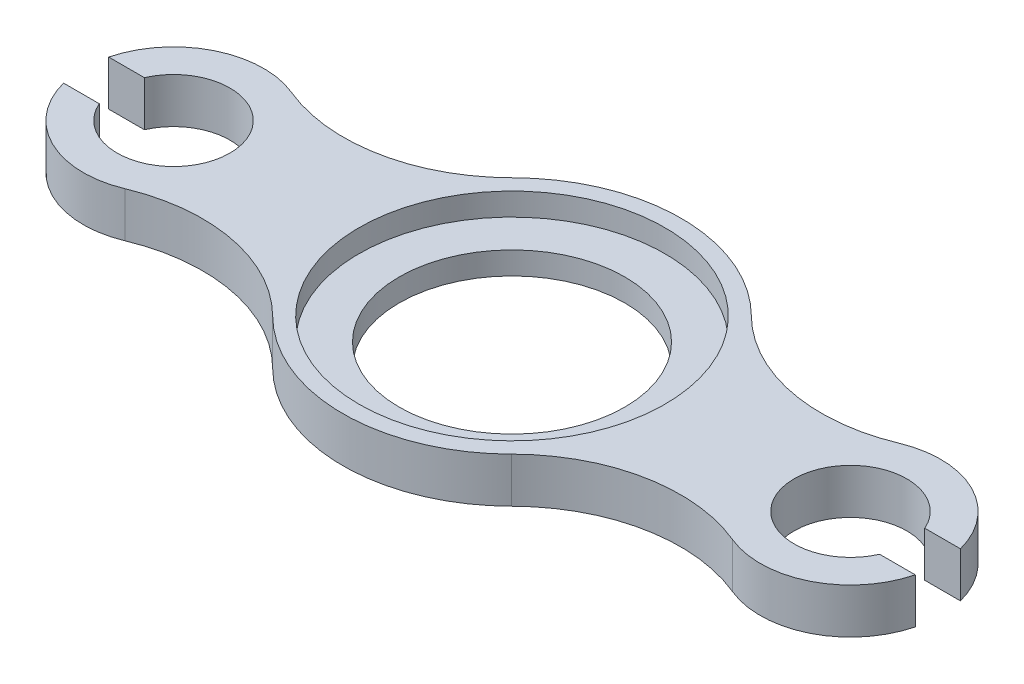
ISO-10303-21;
HEADER;
FILE_DESCRIPTION(('STEP AP214'),'2;1');
FILE_NAME('part.step','',(''),(''),'','','');
FILE_SCHEMA(('AUTOMOTIVE_DESIGN { 1 0 10303 214 1 1 1 1 }'));
ENDSEC;
DATA;
#1=APPLICATION_CONTEXT('core data for automotive mechanical design processes');
#2=APPLICATION_PROTOCOL_DEFINITION('international standard','automotive_design',2000,#1);
#3=PRODUCT_CONTEXT('',#1,'mechanical');
#4=PRODUCT('Part','Part','',(#3));
#5=PRODUCT_RELATED_PRODUCT_CATEGORY('part','',(#4));
#6=PRODUCT_DEFINITION_FORMATION('','',#4);
#7=PRODUCT_DEFINITION_CONTEXT('part definition',#1,'design');
#8=PRODUCT_DEFINITION('design','',#6,#7);
#9=PRODUCT_DEFINITION_SHAPE('','',#8);
#10=(LENGTH_UNIT() NAMED_UNIT(*) SI_UNIT(.MILLI.,.METRE.));
#11=(NAMED_UNIT(*) PLANE_ANGLE_UNIT() SI_UNIT($,.RADIAN.));
#12=(NAMED_UNIT(*) SI_UNIT($,.STERADIAN.) SOLID_ANGLE_UNIT());
#13=UNCERTAINTY_MEASURE_WITH_UNIT(LENGTH_MEASURE(1.E-05),#10,'distance_accuracy_value','');
#14=(GEOMETRIC_REPRESENTATION_CONTEXT(3) GLOBAL_UNCERTAINTY_ASSIGNED_CONTEXT((#13)) GLOBAL_UNIT_ASSIGNED_CONTEXT((#10,
#11,#12)) REPRESENTATION_CONTEXT('',''));
#15=CARTESIAN_POINT('',(0.,0.,0.));
#16=DIRECTION('',(0.,0.,1.));
#17=DIRECTION('',(1.,0.,0.));
#18=AXIS2_PLACEMENT_3D('',#15,#16,#17);
#19=CARTESIAN_POINT('',(-150.,20.,0.));
#20=DIRECTION('',(0.,-1.,0.));
#21=DIRECTION('',(0.,0.,-1.));
#22=AXIS2_PLACEMENT_3D('',#19,#20,#21);
#23=CYLINDRICAL_SURFACE('',#22,25.);
#24=CARTESIAN_POINT('',(-150.,0.,0.));
#25=DIRECTION('',(0.,1.,0.));
#26=DIRECTION('',(0.,0.,1.));
#27=AXIS2_PLACEMENT_3D('',#24,#25,#26);
#28=CIRCLE('',#27,25.);
#29=CARTESIAN_POINT('',(-172.912878474779,0.,-10.));
#30=VERTEX_POINT('',#29);
#31=CARTESIAN_POINT('',(-172.912878474779,0.,10.));
#32=VERTEX_POINT('',#31);
#33=EDGE_CURVE('E183',#30,#32,#28,.F.);
#34=ORIENTED_EDGE('',*,*,#33,.T.);
#35=DIRECTION('',(0.,-1.,0.));
#36=VECTOR('',#35,1.);
#37=CARTESIAN_POINT('',(-172.912878474779,20.,10.));
#38=LINE('',#37,#36);
#39=CARTESIAN_POINT('',(-172.912878474779,20.,10.));
#40=VERTEX_POINT('',#39);
#41=EDGE_CURVE('E11',#40,#32,#38,.T.);
#42=ORIENTED_EDGE('',*,*,#41,.F.);
#43=CARTESIAN_POINT('',(-150.,20.,0.));
#44=DIRECTION('',(0.,1.,0.));
#45=DIRECTION('',(0.,0.,1.));
#46=AXIS2_PLACEMENT_3D('',#43,#44,#45);
#47=CIRCLE('',#46,25.);
#48=CARTESIAN_POINT('',(-172.912878474779,20.,-10.));
#49=VERTEX_POINT('',#48);
#50=EDGE_CURVE('E505',#49,#40,#47,.F.);
#51=ORIENTED_EDGE('',*,*,#50,.F.);
#52=DIRECTION('',(0.,-1.,0.));
#53=VECTOR('',#52,1.);
#54=CARTESIAN_POINT('',(-172.912878474779,20.,-10.));
#55=LINE('',#54,#53);
#56=EDGE_CURVE('E54',#49,#30,#55,.T.);
#57=ORIENTED_EDGE('',*,*,#56,.T.);
#58=EDGE_LOOP('',(#34,#42,#51,#57));
#59=FACE_BOUND('',#58,.T.);
#60=ADVANCED_FACE('F37',(#59),#23,.F.);
#61=CARTESIAN_POINT('',(0.,20.,10.));
#62=DIRECTION('',(0.,0.,1.));
#63=DIRECTION('',(1.,0.,0.));
#64=AXIS2_PLACEMENT_3D('',#61,#62,#63);
#65=PLANE('',#64);
#66=DIRECTION('',(-1.,0.,0.));
#67=VECTOR('',#66,1.);
#68=CARTESIAN_POINT('',(0.,0.,10.));
#69=LINE('',#68,#67);
#70=CARTESIAN_POINT('',(-188.729833462074,0.,9.99999999999999));
#71=VERTEX_POINT('',#70);
#72=EDGE_CURVE('E185',#32,#71,#69,.T.);
#73=ORIENTED_EDGE('',*,*,#72,.T.);
#74=DIRECTION('',(0.,-1.,0.));
#75=VECTOR('',#74,1.);
#76=CARTESIAN_POINT('',(-188.729833462074,20.,9.99999999999999));
#77=LINE('',#76,#75);
#78=CARTESIAN_POINT('',(-188.729833462074,20.,9.99999999999999));
#79=VERTEX_POINT('',#78);
#80=EDGE_CURVE('E46',#79,#71,#77,.T.);
#81=ORIENTED_EDGE('',*,*,#80,.F.);
#82=DIRECTION('',(-1.,0.,0.));
#83=VECTOR('',#82,1.);
#84=CARTESIAN_POINT('',(0.,20.,10.));
#85=LINE('',#84,#83);
#86=EDGE_CURVE('E116',#40,#79,#85,.T.);
#87=ORIENTED_EDGE('',*,*,#86,.F.);
#88=ORIENTED_EDGE('',*,*,#41,.T.);
#89=EDGE_LOOP('',(#73,#81,#87,#88));
#90=FACE_BOUND('',#89,.T.);
#91=ADVANCED_FACE('F312',(#90),#65,.F.);
#92=CARTESIAN_POINT('',(-150.,20.,0.));
#93=DIRECTION('',(0.,-1.,0.));
#94=DIRECTION('',(0.,0.,-1.));
#95=AXIS2_PLACEMENT_3D('',#92,#93,#94);
#96=CYLINDRICAL_SURFACE('',#95,40.);
#97=CARTESIAN_POINT('',(-150.,0.,0.));
#98=DIRECTION('',(0.,1.,0.));
#99=DIRECTION('',(0.,0.,1.));
#100=AXIS2_PLACEMENT_3D('',#97,#98,#99);
#101=CIRCLE('',#100,40.);
#102=CARTESIAN_POINT('',(-134.666666666667,0.,36.9444026733264));
#103=VERTEX_POINT('',#102);
#104=EDGE_CURVE('E188',#71,#103,#101,.T.);
#105=ORIENTED_EDGE('',*,*,#104,.T.);
#106=DIRECTION('',(0.,-1.,0.));
#107=VECTOR('',#106,1.);
#108=CARTESIAN_POINT('',(-134.666666666667,20.,36.9444026733264));
#109=LINE('',#108,#107);
#110=CARTESIAN_POINT('',(-134.666666666667,20.,36.9444026733264));
#111=VERTEX_POINT('',#110);
#112=EDGE_CURVE('E248',#111,#103,#109,.T.);
#113=ORIENTED_EDGE('',*,*,#112,.F.);
#114=CARTESIAN_POINT('',(-150.,20.,0.));
#115=DIRECTION('',(0.,1.,0.));
#116=DIRECTION('',(0.,0.,1.));
#117=AXIS2_PLACEMENT_3D('',#114,#115,#116);
#118=CIRCLE('',#117,40.);
#119=EDGE_CURVE('E256',#79,#111,#118,.T.);
#120=ORIENTED_EDGE('',*,*,#119,.F.);
#121=ORIENTED_EDGE('',*,*,#80,.T.);
#122=EDGE_LOOP('',(#105,#113,#120,#121));
#123=FACE_BOUND('',#122,.T.);
#124=ADVANCED_FACE('F254',(#123),#96,.T.);
#125=CARTESIAN_POINT('',(-105.916666666667,20.,106.215157685813));
#126=DIRECTION('',(0.,-1.,0.));
#127=DIRECTION('',(0.,0.,-1.));
#128=AXIS2_PLACEMENT_3D('',#125,#126,#127);
#129=CYLINDRICAL_SURFACE('',#128,75.);
#130=CARTESIAN_POINT('',(-105.916666666667,0.,106.215157685813));
#131=DIRECTION('',(0.,1.,0.));
#132=DIRECTION('',(0.,0.,1.));
#133=AXIS2_PLACEMENT_3D('',#130,#131,#132);
#134=CIRCLE('',#133,75.);
#135=CARTESIAN_POINT('',(-52.9583333333333,0.,53.1075788429067));
#136=VERTEX_POINT('',#135);
#137=EDGE_CURVE('E190',#103,#136,#134,.F.);
#138=ORIENTED_EDGE('',*,*,#137,.T.);
#139=DIRECTION('',(0.,-1.,0.));
#140=VECTOR('',#139,1.);
#141=CARTESIAN_POINT('',(-52.9583333333333,20.,53.1075788429067));
#142=LINE('',#141,#140);
#143=CARTESIAN_POINT('',(-52.9583333333333,20.,53.1075788429067));
#144=VERTEX_POINT('',#143);
#145=EDGE_CURVE('E245',#144,#136,#142,.T.);
#146=ORIENTED_EDGE('',*,*,#145,.F.);
#147=CARTESIAN_POINT('',(-105.916666666667,20.,106.215157685813));
#148=DIRECTION('',(0.,1.,0.));
#149=DIRECTION('',(0.,0.,1.));
#150=AXIS2_PLACEMENT_3D('',#147,#148,#149);
#151=CIRCLE('',#150,75.);
#152=EDGE_CURVE('E274',#111,#144,#151,.F.);
#153=ORIENTED_EDGE('',*,*,#152,.F.);
#154=ORIENTED_EDGE('',*,*,#112,.T.);
#155=EDGE_LOOP('',(#138,#146,#153,#154));
#156=FACE_BOUND('',#155,.T.);
#157=ADVANCED_FACE('F265',(#156),#129,.F.);
#158=CARTESIAN_POINT('',(0.,20.,0.));
#159=DIRECTION('',(0.,-1.,0.));
#160=DIRECTION('',(0.,0.,-1.));
#161=AXIS2_PLACEMENT_3D('',#158,#159,#160);
#162=CYLINDRICAL_SURFACE('',#161,75.);
#163=CARTESIAN_POINT('',(0.,0.,0.));
#164=DIRECTION('',(0.,1.,0.));
#165=DIRECTION('',(0.,0.,1.));
#166=AXIS2_PLACEMENT_3D('',#163,#164,#165);
#167=CIRCLE('',#166,75.);
#168=CARTESIAN_POINT('',(52.9583333333333,0.,53.1075788429067));
#169=VERTEX_POINT('',#168);
#170=EDGE_CURVE('E192',#136,#169,#167,.T.);
#171=ORIENTED_EDGE('',*,*,#170,.T.);
#172=DIRECTION('',(0.,-1.,0.));
#173=VECTOR('',#172,1.);
#174=CARTESIAN_POINT('',(52.9583333333333,20.,53.1075788429067));
#175=LINE('',#174,#173);
#176=CARTESIAN_POINT('',(52.9583333333333,20.,53.1075788429067));
#177=VERTEX_POINT('',#176);
#178=EDGE_CURVE('E242',#177,#169,#175,.T.);
#179=ORIENTED_EDGE('',*,*,#178,.F.);
#180=CARTESIAN_POINT('',(0.,20.,0.));
#181=DIRECTION('',(0.,1.,0.));
#182=DIRECTION('',(0.,0.,1.));
#183=AXIS2_PLACEMENT_3D('',#180,#181,#182);
#184=CIRCLE('',#183,75.);
#185=EDGE_CURVE('E271',#144,#177,#184,.T.);
#186=ORIENTED_EDGE('',*,*,#185,.F.);
#187=ORIENTED_EDGE('',*,*,#145,.T.);
#188=EDGE_LOOP('',(#171,#179,#186,#187));
#189=FACE_BOUND('',#188,.T.);
#190=ADVANCED_FACE('F269',(#189),#162,.T.);
#191=CARTESIAN_POINT('',(105.916666666667,20.,106.215157685813));
#192=DIRECTION('',(0.,-1.,0.));
#193=DIRECTION('',(0.,0.,-1.));
#194=AXIS2_PLACEMENT_3D('',#191,#192,#193);
#195=CYLINDRICAL_SURFACE('',#194,75.);
#196=CARTESIAN_POINT('',(105.916666666667,0.,106.215157685813));
#197=DIRECTION('',(0.,1.,0.));
#198=DIRECTION('',(0.,0.,1.));
#199=AXIS2_PLACEMENT_3D('',#196,#197,#198);
#200=CIRCLE('',#199,75.);
#201=CARTESIAN_POINT('',(134.666666666667,0.,36.9444026733264));
#202=VERTEX_POINT('',#201);
#203=EDGE_CURVE('E194',#169,#202,#200,.F.);
#204=ORIENTED_EDGE('',*,*,#203,.T.);
#205=DIRECTION('',(0.,-1.,0.));
#206=VECTOR('',#205,1.);
#207=CARTESIAN_POINT('',(134.666666666667,20.,36.9444026733264));
#208=LINE('',#207,#206);
#209=CARTESIAN_POINT('',(134.666666666667,20.,36.9444026733264));
#210=VERTEX_POINT('',#209);
#211=EDGE_CURVE('E239',#210,#202,#208,.T.);
#212=ORIENTED_EDGE('',*,*,#211,.F.);
#213=CARTESIAN_POINT('',(105.916666666667,20.,106.215157685813));
#214=DIRECTION('',(0.,1.,0.));
#215=DIRECTION('',(0.,0.,1.));
#216=AXIS2_PLACEMENT_3D('',#213,#214,#215);
#217=CIRCLE('',#216,75.);
#218=EDGE_CURVE('E273',#177,#210,#217,.F.);
#219=ORIENTED_EDGE('',*,*,#218,.F.);
#220=ORIENTED_EDGE('',*,*,#178,.T.);
#221=EDGE_LOOP('',(#204,#212,#219,#220));
#222=FACE_BOUND('',#221,.T.);
#223=ADVANCED_FACE('F324',(#222),#195,.F.);
#224=CARTESIAN_POINT('',(150.,20.,0.));
#225=DIRECTION('',(0.,-1.,0.));
#226=DIRECTION('',(0.,0.,-1.));
#227=AXIS2_PLACEMENT_3D('',#224,#225,#226);
#228=CYLINDRICAL_SURFACE('',#227,40.);
#229=CARTESIAN_POINT('',(150.,0.,0.));
#230=DIRECTION('',(0.,1.,0.));
#231=DIRECTION('',(0.,0.,1.));
#232=AXIS2_PLACEMENT_3D('',#229,#230,#231);
#233=CIRCLE('',#232,40.);
#234=CARTESIAN_POINT('',(188.729833462074,0.,10.));
#235=VERTEX_POINT('',#234);
#236=EDGE_CURVE('E196',#202,#235,#233,.T.);
#237=ORIENTED_EDGE('',*,*,#236,.T.);
#238=DIRECTION('',(0.,-1.,0.));
#239=VECTOR('',#238,1.);
#240=CARTESIAN_POINT('',(188.729833462074,20.,10.));
#241=LINE('',#240,#239);
#242=CARTESIAN_POINT('',(188.729833462074,20.,10.));
#243=VERTEX_POINT('',#242);
#244=EDGE_CURVE('E236',#243,#235,#241,.T.);
#245=ORIENTED_EDGE('',*,*,#244,.F.);
#246=CARTESIAN_POINT('',(150.,20.,0.));
#247=DIRECTION('',(0.,1.,0.));
#248=DIRECTION('',(0.,0.,1.));
#249=AXIS2_PLACEMENT_3D('',#246,#247,#248);
#250=CIRCLE('',#249,40.);
#251=EDGE_CURVE('E276',#210,#243,#250,.T.);
#252=ORIENTED_EDGE('',*,*,#251,.F.);
#253=ORIENTED_EDGE('',*,*,#211,.T.);
#254=EDGE_LOOP('',(#237,#245,#252,#253));
#255=FACE_BOUND('',#254,.T.);
#256=ADVANCED_FACE('F327',(#255),#228,.T.);
#257=CARTESIAN_POINT('',(0.,20.,10.));
#258=DIRECTION('',(0.,0.,1.));
#259=DIRECTION('',(1.,0.,0.));
#260=AXIS2_PLACEMENT_3D('',#257,#258,#259);
#261=PLANE('',#260);
#262=DIRECTION('',(-1.,0.,0.));
#263=VECTOR('',#262,1.);
#264=CARTESIAN_POINT('',(0.,0.,10.));
#265=LINE('',#264,#263);
#266=CARTESIAN_POINT('',(172.912878474779,0.,10.));
#267=VERTEX_POINT('',#266);
#268=EDGE_CURVE('E198',#235,#267,#265,.T.);
#269=ORIENTED_EDGE('',*,*,#268,.T.);
#270=DIRECTION('',(0.,-1.,0.));
#271=VECTOR('',#270,1.);
#272=CARTESIAN_POINT('',(172.912878474779,20.,10.));
#273=LINE('',#272,#271);
#274=CARTESIAN_POINT('',(172.912878474779,20.,10.));
#275=VERTEX_POINT('',#274);
#276=EDGE_CURVE('E234',#275,#267,#273,.T.);
#277=ORIENTED_EDGE('',*,*,#276,.F.);
#278=DIRECTION('',(-1.,0.,0.));
#279=VECTOR('',#278,1.);
#280=CARTESIAN_POINT('',(0.,20.,10.));
#281=LINE('',#280,#279);
#282=EDGE_CURVE('E282',#243,#275,#281,.T.);
#283=ORIENTED_EDGE('',*,*,#282,.F.);
#284=ORIENTED_EDGE('',*,*,#244,.T.);
#285=EDGE_LOOP('',(#269,#277,#283,#284));
#286=FACE_BOUND('',#285,.T.);
#287=ADVANCED_FACE('F331',(#286),#261,.F.);
#288=CARTESIAN_POINT('',(150.,20.,0.));
#289=DIRECTION('',(0.,-1.,0.));
#290=DIRECTION('',(0.,0.,-1.));
#291=AXIS2_PLACEMENT_3D('',#288,#289,#290);
#292=CYLINDRICAL_SURFACE('',#291,25.);
#293=CARTESIAN_POINT('',(150.,0.,0.));
#294=DIRECTION('',(0.,1.,0.));
#295=DIRECTION('',(0.,0.,1.));
#296=AXIS2_PLACEMENT_3D('',#293,#294,#295);
#297=CIRCLE('',#296,25.);
#298=CARTESIAN_POINT('',(172.912878474779,0.,-10.));
#299=VERTEX_POINT('',#298);
#300=EDGE_CURVE('E201',#299,#267,#297,.T.);
#301=ORIENTED_EDGE('',*,*,#300,.F.);
#302=DIRECTION('',(0.,-1.,0.));
#303=VECTOR('',#302,1.);
#304=CARTESIAN_POINT('',(172.912878474779,20.,-10.));
#305=LINE('',#304,#303);
#306=CARTESIAN_POINT('',(172.912878474779,20.,-10.));
#307=VERTEX_POINT('',#306);
#308=EDGE_CURVE('E232',#307,#299,#305,.T.);
#309=ORIENTED_EDGE('',*,*,#308,.F.);
#310=CARTESIAN_POINT('',(150.,20.,0.));
#311=DIRECTION('',(0.,1.,0.));
#312=DIRECTION('',(0.,0.,1.));
#313=AXIS2_PLACEMENT_3D('',#310,#311,#312);
#314=CIRCLE('',#313,25.);
#315=EDGE_CURVE('E284',#307,#275,#314,.T.);
#316=ORIENTED_EDGE('',*,*,#315,.T.);
#317=ORIENTED_EDGE('',*,*,#276,.T.);
#318=EDGE_LOOP('',(#301,#309,#316,#317));
#319=FACE_BOUND('',#318,.T.);
#320=ADVANCED_FACE('F335',(#319),#292,.F.);
#321=CARTESIAN_POINT('',(0.,20.,-10.));
#322=DIRECTION('',(0.,0.,1.));
#323=DIRECTION('',(1.,0.,0.));
#324=AXIS2_PLACEMENT_3D('',#321,#322,#323);
#325=PLANE('',#324);
#326=DIRECTION('',(-1.,0.,0.));
#327=VECTOR('',#326,1.);
#328=CARTESIAN_POINT('',(0.,0.,-10.));
#329=LINE('',#328,#327);
#330=CARTESIAN_POINT('',(188.729833462074,0.,-10.));
#331=VERTEX_POINT('',#330);
#332=EDGE_CURVE('E204',#331,#299,#329,.T.);
#333=ORIENTED_EDGE('',*,*,#332,.F.);
#334=DIRECTION('',(0.,-1.,0.));
#335=VECTOR('',#334,1.);
#336=CARTESIAN_POINT('',(188.729833462074,20.,-10.));
#337=LINE('',#336,#335);
#338=CARTESIAN_POINT('',(188.729833462074,20.,-10.));
#339=VERTEX_POINT('',#338);
#340=EDGE_CURVE('E230',#339,#331,#337,.T.);
#341=ORIENTED_EDGE('',*,*,#340,.F.);
#342=DIRECTION('',(-1.,0.,0.));
#343=VECTOR('',#342,1.);
#344=CARTESIAN_POINT('',(0.,20.,-10.));
#345=LINE('',#344,#343);
#346=EDGE_CURVE('E287',#339,#307,#345,.T.);
#347=ORIENTED_EDGE('',*,*,#346,.T.);
#348=ORIENTED_EDGE('',*,*,#308,.T.);
#349=EDGE_LOOP('',(#333,#341,#347,#348));
#350=FACE_BOUND('',#349,.T.);
#351=ADVANCED_FACE('F339',(#350),#325,.T.);
#352=CARTESIAN_POINT('',(150.,20.,0.));
#353=DIRECTION('',(0.,-1.,0.));
#354=DIRECTION('',(0.,0.,-1.));
#355=AXIS2_PLACEMENT_3D('',#352,#353,#354);
#356=CYLINDRICAL_SURFACE('',#355,40.);
#357=CARTESIAN_POINT('',(150.,0.,0.));
#358=DIRECTION('',(0.,1.,0.));
#359=DIRECTION('',(0.,0.,1.));
#360=AXIS2_PLACEMENT_3D('',#357,#358,#359);
#361=CIRCLE('',#360,40.);
#362=CARTESIAN_POINT('',(134.666666666667,0.,-36.9444026733264));
#363=VERTEX_POINT('',#362);
#364=EDGE_CURVE('E207',#363,#331,#361,.F.);
#365=ORIENTED_EDGE('',*,*,#364,.F.);
#366=DIRECTION('',(0.,-1.,0.));
#367=VECTOR('',#366,1.);
#368=CARTESIAN_POINT('',(134.666666666667,20.,-36.9444026733264));
#369=LINE('',#368,#367);
#370=CARTESIAN_POINT('',(134.666666666667,20.,-36.9444026733264));
#371=VERTEX_POINT('',#370);
#372=EDGE_CURVE('E228',#371,#363,#369,.T.);
#373=ORIENTED_EDGE('',*,*,#372,.F.);
#374=CARTESIAN_POINT('',(150.,20.,0.));
#375=DIRECTION('',(0.,1.,0.));
#376=DIRECTION('',(0.,0.,1.));
#377=AXIS2_PLACEMENT_3D('',#374,#375,#376);
#378=CIRCLE('',#377,40.);
#379=EDGE_CURVE('E290',#371,#339,#378,.F.);
#380=ORIENTED_EDGE('',*,*,#379,.T.);
#381=ORIENTED_EDGE('',*,*,#340,.T.);
#382=EDGE_LOOP('',(#365,#373,#380,#381));
#383=FACE_BOUND('',#382,.T.);
#384=ADVANCED_FACE('F343',(#383),#356,.T.);
#385=CARTESIAN_POINT('',(105.916666666667,20.,-106.215157685813));
#386=DIRECTION('',(0.,-1.,0.));
#387=DIRECTION('',(0.,0.,-1.));
#388=AXIS2_PLACEMENT_3D('',#385,#386,#387);
#389=CYLINDRICAL_SURFACE('',#388,75.);
#390=CARTESIAN_POINT('',(105.916666666667,0.,-106.215157685813));
#391=DIRECTION('',(0.,1.,0.));
#392=DIRECTION('',(0.,0.,1.));
#393=AXIS2_PLACEMENT_3D('',#390,#391,#392);
#394=CIRCLE('',#393,75.);
#395=CARTESIAN_POINT('',(52.9583333333333,0.,-53.1075788429067));
#396=VERTEX_POINT('',#395);
#397=EDGE_CURVE('E210',#396,#363,#394,.T.);
#398=ORIENTED_EDGE('',*,*,#397,.F.);
#399=DIRECTION('',(0.,-1.,0.));
#400=VECTOR('',#399,1.);
#401=CARTESIAN_POINT('',(52.9583333333333,20.,-53.1075788429067));
#402=LINE('',#401,#400);
#403=CARTESIAN_POINT('',(52.9583333333333,20.,-53.1075788429067));
#404=VERTEX_POINT('',#403);
#405=EDGE_CURVE('E226',#404,#396,#402,.T.);
#406=ORIENTED_EDGE('',*,*,#405,.F.);
#407=CARTESIAN_POINT('',(105.916666666667,20.,-106.215157685813));
#408=DIRECTION('',(0.,1.,0.));
#409=DIRECTION('',(0.,0.,1.));
#410=AXIS2_PLACEMENT_3D('',#407,#408,#409);
#411=CIRCLE('',#410,75.);
#412=EDGE_CURVE('E293',#404,#371,#411,.T.);
#413=ORIENTED_EDGE('',*,*,#412,.T.);
#414=ORIENTED_EDGE('',*,*,#372,.T.);
#415=EDGE_LOOP('',(#398,#406,#413,#414));
#416=FACE_BOUND('',#415,.T.);
#417=ADVANCED_FACE('F347',(#416),#389,.F.);
#418=CARTESIAN_POINT('',(0.,20.,0.));
#419=DIRECTION('',(0.,-1.,0.));
#420=DIRECTION('',(0.,0.,-1.));
#421=AXIS2_PLACEMENT_3D('',#418,#419,#420);
#422=CYLINDRICAL_SURFACE('',#421,75.);
#423=CARTESIAN_POINT('',(0.,0.,0.));
#424=DIRECTION('',(0.,1.,0.));
#425=DIRECTION('',(0.,0.,1.));
#426=AXIS2_PLACEMENT_3D('',#423,#424,#425);
#427=CIRCLE('',#426,75.);
#428=CARTESIAN_POINT('',(-52.9583333333334,0.,-53.1075788429067));
#429=VERTEX_POINT('',#428);
#430=EDGE_CURVE('E213',#429,#396,#427,.F.);
#431=ORIENTED_EDGE('',*,*,#430,.F.);
#432=DIRECTION('',(0.,-1.,0.));
#433=VECTOR('',#432,1.);
#434=CARTESIAN_POINT('',(-52.9583333333334,20.,-53.1075788429067));
#435=LINE('',#434,#433);
#436=CARTESIAN_POINT('',(-52.9583333333334,20.,-53.1075788429067));
#437=VERTEX_POINT('',#436);
#438=EDGE_CURVE('E165',#437,#429,#435,.T.);
#439=ORIENTED_EDGE('',*,*,#438,.F.);
#440=CARTESIAN_POINT('',(0.,20.,0.));
#441=DIRECTION('',(0.,1.,0.));
#442=DIRECTION('',(0.,0.,1.));
#443=AXIS2_PLACEMENT_3D('',#440,#441,#442);
#444=CIRCLE('',#443,75.);
#445=EDGE_CURVE('E175',#437,#404,#444,.F.);
#446=ORIENTED_EDGE('',*,*,#445,.T.);
#447=ORIENTED_EDGE('',*,*,#405,.T.);
#448=EDGE_LOOP('',(#431,#439,#446,#447));
#449=FACE_BOUND('',#448,.T.);
#450=ADVANCED_FACE('F297',(#449),#422,.T.);
#451=CARTESIAN_POINT('',(-105.916666666667,20.,-106.215157685813));
#452=DIRECTION('',(0.,-1.,0.));
#453=DIRECTION('',(0.,0.,-1.));
#454=AXIS2_PLACEMENT_3D('',#451,#452,#453);
#455=CYLINDRICAL_SURFACE('',#454,75.);
#456=CARTESIAN_POINT('',(-105.916666666667,0.,-106.215157685813));
#457=DIRECTION('',(0.,1.,0.));
#458=DIRECTION('',(0.,0.,1.));
#459=AXIS2_PLACEMENT_3D('',#456,#457,#458);
#460=CIRCLE('',#459,75.);
#461=CARTESIAN_POINT('',(-134.666666666667,0.,-36.9444026733264));
#462=VERTEX_POINT('',#461);
#463=EDGE_CURVE('E161',#462,#429,#460,.T.);
#464=ORIENTED_EDGE('',*,*,#463,.F.);
#465=DIRECTION('',(0.,-1.,0.));
#466=VECTOR('',#465,1.);
#467=CARTESIAN_POINT('',(-134.666666666667,20.,-36.9444026733264));
#468=LINE('',#467,#466);
#469=CARTESIAN_POINT('',(-134.666666666667,20.,-36.9444026733264));
#470=VERTEX_POINT('',#469);
#471=EDGE_CURVE('E156',#470,#462,#468,.T.);
#472=ORIENTED_EDGE('',*,*,#471,.F.);
#473=CARTESIAN_POINT('',(-105.916666666667,20.,-106.215157685813));
#474=DIRECTION('',(0.,1.,0.));
#475=DIRECTION('',(0.,0.,1.));
#476=AXIS2_PLACEMENT_3D('',#473,#474,#475);
#477=CIRCLE('',#476,75.);
#478=EDGE_CURVE('E159',#470,#437,#477,.T.);
#479=ORIENTED_EDGE('',*,*,#478,.T.);
#480=ORIENTED_EDGE('',*,*,#438,.T.);
#481=EDGE_LOOP('',(#464,#472,#479,#480));
#482=FACE_BOUND('',#481,.T.);
#483=ADVANCED_FACE('F158',(#482),#455,.F.);
#484=CARTESIAN_POINT('',(-150.,20.,0.));
#485=DIRECTION('',(0.,-1.,0.));
#486=DIRECTION('',(0.,0.,-1.));
#487=AXIS2_PLACEMENT_3D('',#484,#485,#486);
#488=CYLINDRICAL_SURFACE('',#487,40.);
#489=CARTESIAN_POINT('',(-150.,0.,0.));
#490=DIRECTION('',(0.,1.,0.));
#491=DIRECTION('',(0.,0.,1.));
#492=AXIS2_PLACEMENT_3D('',#489,#490,#491);
#493=CIRCLE('',#492,40.);
#494=CARTESIAN_POINT('',(-188.729833462074,0.,-9.99999999999999));
#495=VERTEX_POINT('',#494);
#496=EDGE_CURVE('E217',#495,#462,#493,.F.);
#497=ORIENTED_EDGE('',*,*,#496,.F.);
#498=DIRECTION('',(0.,-1.,0.));
#499=VECTOR('',#498,1.);
#500=CARTESIAN_POINT('',(-188.729833462074,20.,-9.99999999999999));
#501=LINE('',#500,#499);
#502=CARTESIAN_POINT('',(-188.729833462074,20.,-9.99999999999999));
#503=VERTEX_POINT('',#502);
#504=EDGE_CURVE('E104',#503,#495,#501,.T.);
#505=ORIENTED_EDGE('',*,*,#504,.F.);
#506=CARTESIAN_POINT('',(-150.,20.,0.));
#507=DIRECTION('',(0.,1.,0.));
#508=DIRECTION('',(0.,0.,1.));
#509=AXIS2_PLACEMENT_3D('',#506,#507,#508);
#510=CIRCLE('',#509,40.);
#511=EDGE_CURVE('E172',#503,#470,#510,.F.);
#512=ORIENTED_EDGE('',*,*,#511,.T.);
#513=ORIENTED_EDGE('',*,*,#471,.T.);
#514=EDGE_LOOP('',(#497,#505,#512,#513));
#515=FACE_BOUND('',#514,.T.);
#516=ADVANCED_FACE('F177',(#515),#488,.T.);
#517=CARTESIAN_POINT('',(0.,20.,0.));
#518=DIRECTION('',(0.,-1.,0.));
#519=DIRECTION('',(0.,0.,-1.));
#520=AXIS2_PLACEMENT_3D('',#517,#518,#519);
#521=CYLINDRICAL_SURFACE('',#520,67.8);
#522=CARTESIAN_POINT('',(0.,10.,0.));
#523=DIRECTION('',(0.,1.,0.));
#524=DIRECTION('',(0.,0.,1.));
#525=AXIS2_PLACEMENT_3D('',#522,#523,#524);
#526=CIRCLE('',#525,67.8);
#527=CARTESIAN_POINT('',(0.,10.,67.8));
#528=VERTEX_POINT('',#527);
#529=EDGE_CURVE('E186',#528,#528,#526,.F.);
#530=ORIENTED_EDGE('',*,*,#529,.T.);
#531=EDGE_LOOP('',(#530));
#532=FACE_BOUND('',#531,.T.);
#533=CARTESIAN_POINT('',(0.,20.,0.));
#534=DIRECTION('',(0.,1.,0.));
#535=DIRECTION('',(0.,0.,1.));
#536=AXIS2_PLACEMENT_3D('',#533,#534,#535);
#537=CIRCLE('',#536,67.8);
#538=CARTESIAN_POINT('',(0.,20.,67.8));
#539=VERTEX_POINT('',#538);
#540=EDGE_CURVE('E222',#539,#539,#537,.F.);
#541=ORIENTED_EDGE('',*,*,#540,.F.);
#542=EDGE_LOOP('',(#541));
#543=FACE_BOUND('',#542,.T.);
#544=ADVANCED_FACE('F39',(#532,#543),#521,.F.);
#545=CARTESIAN_POINT('',(0.,20.,-10.));
#546=DIRECTION('',(0.,0.,1.));
#547=DIRECTION('',(1.,0.,0.));
#548=AXIS2_PLACEMENT_3D('',#545,#546,#547);
#549=PLANE('',#548);
#550=DIRECTION('',(-1.,0.,0.));
#551=VECTOR('',#550,1.);
#552=CARTESIAN_POINT('',(0.,0.,-10.));
#553=LINE('',#552,#551);
#554=EDGE_CURVE('E219',#30,#495,#553,.T.);
#555=ORIENTED_EDGE('',*,*,#554,.F.);
#556=ORIENTED_EDGE('',*,*,#56,.F.);
#557=DIRECTION('',(-1.,0.,0.));
#558=VECTOR('',#557,1.);
#559=CARTESIAN_POINT('',(0.,20.,-10.));
#560=LINE('',#559,#558);
#561=EDGE_CURVE('E178',#49,#503,#560,.T.);
#562=ORIENTED_EDGE('',*,*,#561,.T.);
#563=ORIENTED_EDGE('',*,*,#504,.T.);
#564=EDGE_LOOP('',(#555,#556,#562,#563));
#565=FACE_BOUND('',#564,.T.);
#566=ADVANCED_FACE('F299',(#565),#549,.T.);
#567=CARTESIAN_POINT('',(0.,20.,0.));
#568=DIRECTION('',(0.,1.,0.));
#569=DIRECTION('',(0.,0.,1.));
#570=AXIS2_PLACEMENT_3D('',#567,#568,#569);
#571=PLANE('',#570);
#572=ORIENTED_EDGE('',*,*,#540,.T.);
#573=EDGE_LOOP('',(#572));
#574=FACE_BOUND('',#573,.T.);
#575=ORIENTED_EDGE('',*,*,#50,.T.);
#576=ORIENTED_EDGE('',*,*,#86,.T.);
#577=ORIENTED_EDGE('',*,*,#119,.T.);
#578=ORIENTED_EDGE('',*,*,#152,.T.);
#579=ORIENTED_EDGE('',*,*,#185,.T.);
#580=ORIENTED_EDGE('',*,*,#218,.T.);
#581=ORIENTED_EDGE('',*,*,#251,.T.);
#582=ORIENTED_EDGE('',*,*,#282,.T.);
#583=ORIENTED_EDGE('',*,*,#315,.F.);
#584=ORIENTED_EDGE('',*,*,#346,.F.);
#585=ORIENTED_EDGE('',*,*,#379,.F.);
#586=ORIENTED_EDGE('',*,*,#412,.F.);
#587=ORIENTED_EDGE('',*,*,#445,.F.);
#588=ORIENTED_EDGE('',*,*,#478,.F.);
#589=ORIENTED_EDGE('',*,*,#511,.F.);
#590=ORIENTED_EDGE('',*,*,#561,.F.);
#591=EDGE_LOOP('',(#575,#576,#577,#578,#579,#580,#581,#582,#583,#584,#585,#586,#587,#588,#589,#590));
#592=FACE_BOUND('',#591,.T.);
#593=ADVANCED_FACE('F170',(#574,#592),#571,.T.);
#594=CARTESIAN_POINT('',(0.,0.,0.));
#595=DIRECTION('',(0.,1.,0.));
#596=DIRECTION('',(0.,0.,1.));
#597=AXIS2_PLACEMENT_3D('',#594,#595,#596);
#598=PLANE('',#597);
#599=ORIENTED_EDGE('',*,*,#33,.F.);
#600=ORIENTED_EDGE('',*,*,#554,.T.);
#601=ORIENTED_EDGE('',*,*,#496,.T.);
#602=ORIENTED_EDGE('',*,*,#463,.T.);
#603=ORIENTED_EDGE('',*,*,#430,.T.);
#604=ORIENTED_EDGE('',*,*,#397,.T.);
#605=ORIENTED_EDGE('',*,*,#364,.T.);
#606=ORIENTED_EDGE('',*,*,#332,.T.);
#607=ORIENTED_EDGE('',*,*,#300,.T.);
#608=ORIENTED_EDGE('',*,*,#268,.F.);
#609=ORIENTED_EDGE('',*,*,#236,.F.);
#610=ORIENTED_EDGE('',*,*,#203,.F.);
#611=ORIENTED_EDGE('',*,*,#170,.F.);
#612=ORIENTED_EDGE('',*,*,#137,.F.);
#613=ORIENTED_EDGE('',*,*,#104,.F.);
#614=ORIENTED_EDGE('',*,*,#72,.F.);
#615=EDGE_LOOP('',(#599,#600,#601,#602,#603,#604,#605,#606,#607,#608,#609,#610,#611,#612,#613,#614));
#616=FACE_BOUND('',#615,.T.);
#617=CARTESIAN_POINT('',(0.,0.,0.));
#618=DIRECTION('',(0.,1.,0.));
#619=DIRECTION('',(0.,0.,1.));
#620=AXIS2_PLACEMENT_3D('',#617,#618,#619);
#621=CIRCLE('',#620,50.);
#622=CARTESIAN_POINT('',(0.,0.,50.));
#623=VERTEX_POINT('',#622);
#624=EDGE_CURVE('E498',#623,#623,#621,.F.);
#625=ORIENTED_EDGE('',*,*,#624,.F.);
#626=EDGE_LOOP('',(#625));
#627=FACE_BOUND('',#626,.T.);
#628=ADVANCED_FACE('F259',(#616,#627),#598,.F.);
#629=CARTESIAN_POINT('',(0.,10.,0.));
#630=DIRECTION('',(0.,-1.,0.));
#631=DIRECTION('',(0.,0.,-1.));
#632=AXIS2_PLACEMENT_3D('',#629,#630,#631);
#633=CYLINDRICAL_SURFACE('',#632,50.);
#634=CARTESIAN_POINT('',(0.,10.,0.));
#635=DIRECTION('',(0.,1.,0.));
#636=DIRECTION('',(0.,0.,1.));
#637=AXIS2_PLACEMENT_3D('',#634,#635,#636);
#638=CIRCLE('',#637,50.);
#639=CARTESIAN_POINT('',(0.,10.,50.));
#640=VERTEX_POINT('',#639);
#641=EDGE_CURVE('E494',#640,#640,#638,.F.);
#642=ORIENTED_EDGE('',*,*,#641,.F.);
#643=EDGE_LOOP('',(#642));
#644=FACE_BOUND('',#643,.T.);
#645=ORIENTED_EDGE('',*,*,#624,.T.);
#646=EDGE_LOOP('',(#645));
#647=FACE_BOUND('',#646,.T.);
#648=ADVANCED_FACE('F377',(#644,#647),#633,.F.);
#649=CARTESIAN_POINT('',(0.,10.,0.));
#650=DIRECTION('',(0.,1.,0.));
#651=DIRECTION('',(0.,0.,1.));
#652=AXIS2_PLACEMENT_3D('',#649,#650,#651);
#653=PLANE('',#652);
#654=ORIENTED_EDGE('',*,*,#641,.T.);
#655=EDGE_LOOP('',(#654));
#656=FACE_BOUND('',#655,.T.);
#657=ORIENTED_EDGE('',*,*,#529,.F.);
#658=EDGE_LOOP('',(#657));
#659=FACE_BOUND('',#658,.T.);
#660=ADVANCED_FACE('F386',(#656,#659),#653,.T.);
#661=CLOSED_SHELL('',(#60,#91,#124,#157,#190,#223,#256,#287,#320,#351,#384,#417,#450,#483,#516,
#544,#566,#593,#628,#648,#660));
#662=MANIFOLD_SOLID_BREP('B2',#661);
#663=ADVANCED_BREP_SHAPE_REPRESENTATION('',(#18,#662),#14);
#664=SHAPE_DEFINITION_REPRESENTATION(#9,#663);
ENDSEC;
END-ISO-10303-21;
